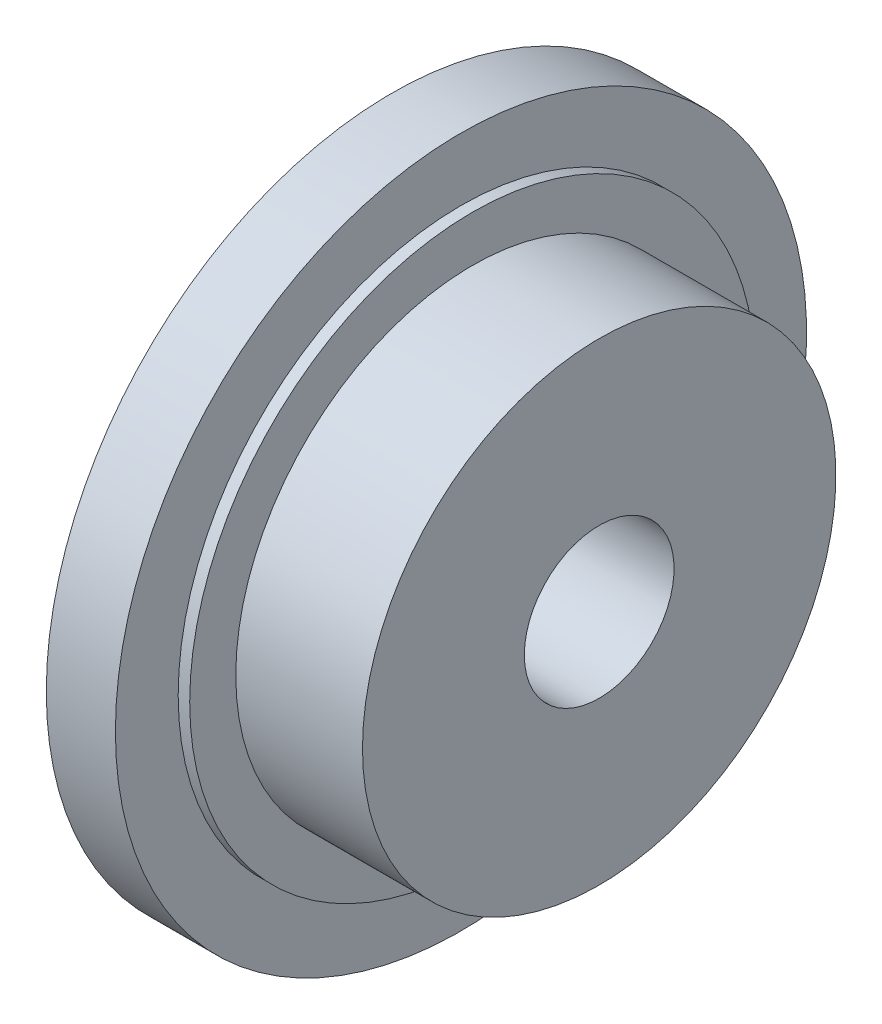
ISO-10303-21;
HEADER;
FILE_DESCRIPTION(('STEP AP214'),'2;1');
FILE_NAME('part.step','',(''),(''),'','','');
FILE_SCHEMA(('AUTOMOTIVE_DESIGN { 1 0 10303 214 1 1 1 1 }'));
ENDSEC;
DATA;
#1=APPLICATION_CONTEXT('core data for automotive mechanical design processes');
#2=APPLICATION_PROTOCOL_DEFINITION('international standard','automotive_design',2000,#1);
#3=PRODUCT_CONTEXT('',#1,'mechanical');
#4=PRODUCT('Part','Part','',(#3));
#5=PRODUCT_RELATED_PRODUCT_CATEGORY('part','',(#4));
#6=PRODUCT_DEFINITION_FORMATION('','',#4);
#7=PRODUCT_DEFINITION_CONTEXT('part definition',#1,'design');
#8=PRODUCT_DEFINITION('design','',#6,#7);
#9=PRODUCT_DEFINITION_SHAPE('','',#8);
#10=(LENGTH_UNIT() NAMED_UNIT(*) SI_UNIT(.MILLI.,.METRE.));
#11=(NAMED_UNIT(*) PLANE_ANGLE_UNIT() SI_UNIT($,.RADIAN.));
#12=(NAMED_UNIT(*) SI_UNIT($,.STERADIAN.) SOLID_ANGLE_UNIT());
#13=UNCERTAINTY_MEASURE_WITH_UNIT(LENGTH_MEASURE(1.E-05),#10,'distance_accuracy_value','');
#14=(GEOMETRIC_REPRESENTATION_CONTEXT(3) GLOBAL_UNCERTAINTY_ASSIGNED_CONTEXT((#13)) GLOBAL_UNIT_ASSIGNED_CONTEXT((#10,
#11,#12)) REPRESENTATION_CONTEXT('',''));
#15=CARTESIAN_POINT('',(0.,0.,0.));
#16=DIRECTION('',(0.,0.,1.));
#17=DIRECTION('',(1.,0.,0.));
#18=AXIS2_PLACEMENT_3D('',#15,#16,#17);
#19=CARTESIAN_POINT('',(0.,0.,0.));
#20=DIRECTION('',(-1.,0.,0.));
#21=DIRECTION('',(0.,0.,1.));
#22=AXIS2_PLACEMENT_3D('',#19,#20,#21);
#23=CYLINDRICAL_SURFACE('',#22,7.5);
#24=CARTESIAN_POINT('',(6.,0.,0.));
#25=DIRECTION('',(-1.,0.,0.));
#26=DIRECTION('',(0.,0.,1.));
#27=AXIS2_PLACEMENT_3D('',#24,#25,#26);
#28=CIRCLE('',#27,7.5);
#29=CARTESIAN_POINT('',(6.,0.,7.5));
#30=VERTEX_POINT('',#29);
#31=EDGE_CURVE('E72',#30,#30,#28,.T.);
#32=ORIENTED_EDGE('',*,*,#31,.F.);
#33=EDGE_LOOP('',(#32));
#34=FACE_BOUND('',#33,.T.);
#35=CARTESIAN_POINT('',(2.,0.,0.));
#36=DIRECTION('',(-1.,0.,0.));
#37=DIRECTION('',(0.,0.,1.));
#38=AXIS2_PLACEMENT_3D('',#35,#36,#37);
#39=CIRCLE('',#38,7.5);
#40=CARTESIAN_POINT('',(2.,0.,7.5));
#41=VERTEX_POINT('',#40);
#42=EDGE_CURVE('E44',#41,#41,#39,.F.);
#43=ORIENTED_EDGE('',*,*,#42,.F.);
#44=EDGE_LOOP('',(#43));
#45=FACE_BOUND('',#44,.T.);
#46=ADVANCED_FACE('F40',(#34,#45),#23,.F.);
#47=CARTESIAN_POINT('',(0.,7.5,0.));
#48=DIRECTION('',(1.,0.,0.));
#49=DIRECTION('',(0.,0.,-1.));
#50=AXIS2_PLACEMENT_3D('',#47,#48,#49);
#51=PLANE('',#50);
#52=CARTESIAN_POINT('',(0.,0.,0.));
#53=DIRECTION('',(-1.,0.,0.));
#54=DIRECTION('',(0.,0.,1.));
#55=AXIS2_PLACEMENT_3D('',#52,#53,#54);
#56=CIRCLE('',#55,8.5);
#57=CARTESIAN_POINT('',(0.,0.,8.5));
#58=VERTEX_POINT('',#57);
#59=EDGE_CURVE('E111',#58,#58,#56,.T.);
#60=ORIENTED_EDGE('',*,*,#59,.F.);
#61=EDGE_LOOP('',(#60));
#62=FACE_BOUND('',#61,.T.);
#63=CARTESIAN_POINT('',(0.,20.,0.));
#64=DIRECTION('',(-1.,0.,0.));
#65=DIRECTION('',(0.,0.,1.));
#66=AXIS2_PLACEMENT_3D('',#63,#64,#65);
#67=CIRCLE('',#66,2.5);
#68=CARTESIAN_POINT('',(0.,20.,2.5));
#69=VERTEX_POINT('',#68);
#70=EDGE_CURVE('E101',#69,#69,#67,.T.);
#71=ORIENTED_EDGE('',*,*,#70,.F.);
#72=EDGE_LOOP('',(#71));
#73=FACE_BOUND('',#72,.T.);
#74=CARTESIAN_POINT('',(0.,10.,-17.3205080756888));
#75=DIRECTION('',(-1.,0.,0.));
#76=DIRECTION('',(0.,0.,1.));
#77=AXIS2_PLACEMENT_3D('',#74,#75,#76);
#78=CIRCLE('',#77,2.5);
#79=CARTESIAN_POINT('',(0.,10.,-14.8205080756888));
#80=VERTEX_POINT('',#79);
#81=EDGE_CURVE('E80',#80,#80,#78,.T.);
#82=ORIENTED_EDGE('',*,*,#81,.F.);
#83=EDGE_LOOP('',(#82));
#84=FACE_BOUND('',#83,.T.);
#85=CARTESIAN_POINT('',(0.,-10.,-17.3205080756888));
#86=DIRECTION('',(-1.,0.,0.));
#87=DIRECTION('',(0.,0.,1.));
#88=AXIS2_PLACEMENT_3D('',#85,#86,#87);
#89=CIRCLE('',#88,2.5);
#90=CARTESIAN_POINT('',(0.,-10.,-14.8205080756888));
#91=VERTEX_POINT('',#90);
#92=EDGE_CURVE('E79',#91,#91,#89,.T.);
#93=ORIENTED_EDGE('',*,*,#92,.F.);
#94=EDGE_LOOP('',(#93));
#95=FACE_BOUND('',#94,.T.);
#96=CARTESIAN_POINT('',(0.,-20.,0.));
#97=DIRECTION('',(-1.,0.,0.));
#98=DIRECTION('',(0.,0.,1.));
#99=AXIS2_PLACEMENT_3D('',#96,#97,#98);
#100=CIRCLE('',#99,2.5);
#101=CARTESIAN_POINT('',(0.,-20.,2.5));
#102=VERTEX_POINT('',#101);
#103=EDGE_CURVE('E86',#102,#102,#100,.T.);
#104=ORIENTED_EDGE('',*,*,#103,.F.);
#105=EDGE_LOOP('',(#104));
#106=FACE_BOUND('',#105,.T.);
#107=CARTESIAN_POINT('',(0.,-10.,17.3205080756888));
#108=DIRECTION('',(-1.,0.,0.));
#109=DIRECTION('',(0.,0.,1.));
#110=AXIS2_PLACEMENT_3D('',#107,#108,#109);
#111=CIRCLE('',#110,2.5);
#112=CARTESIAN_POINT('',(0.,-10.,19.8205080756888));
#113=VERTEX_POINT('',#112);
#114=EDGE_CURVE('E92',#113,#113,#111,.T.);
#115=ORIENTED_EDGE('',*,*,#114,.F.);
#116=EDGE_LOOP('',(#115));
#117=FACE_BOUND('',#116,.T.);
#118=CARTESIAN_POINT('',(0.,10.,17.3205080756888));
#119=DIRECTION('',(-1.,0.,0.));
#120=DIRECTION('',(0.,0.,1.));
#121=AXIS2_PLACEMENT_3D('',#118,#119,#120);
#122=CIRCLE('',#121,2.5);
#123=CARTESIAN_POINT('',(0.,10.,19.8205080756888));
#124=VERTEX_POINT('',#123);
#125=EDGE_CURVE('E98',#124,#124,#122,.T.);
#126=ORIENTED_EDGE('',*,*,#125,.F.);
#127=EDGE_LOOP('',(#126));
#128=FACE_BOUND('',#127,.T.);
#129=CARTESIAN_POINT('',(0.,0.,0.));
#130=DIRECTION('',(-1.,0.,0.));
#131=DIRECTION('',(0.,0.,1.));
#132=AXIS2_PLACEMENT_3D('',#129,#130,#131);
#133=CIRCLE('',#132,30.);
#134=CARTESIAN_POINT('',(0.,0.,30.));
#135=VERTEX_POINT('',#134);
#136=EDGE_CURVE('E10',#135,#135,#133,.T.);
#137=ORIENTED_EDGE('',*,*,#136,.T.);
#138=EDGE_LOOP('',(#137));
#139=FACE_BOUND('',#138,.T.);
#140=ADVANCED_FACE('F42',(#62,#73,#84,#95,#106,#117,#128,#139),#51,.F.);
#141=CARTESIAN_POINT('',(0.,0.,0.));
#142=DIRECTION('',(-1.,0.,0.));
#143=DIRECTION('',(0.,0.,1.));
#144=AXIS2_PLACEMENT_3D('',#141,#142,#143);
#145=CYLINDRICAL_SURFACE('',#144,30.);
#146=ORIENTED_EDGE('',*,*,#136,.F.);
#147=EDGE_LOOP('',(#146));
#148=FACE_BOUND('',#147,.T.);
#149=CARTESIAN_POINT('',(6.,0.,0.));
#150=DIRECTION('',(-1.,0.,0.));
#151=DIRECTION('',(0.,0.,1.));
#152=AXIS2_PLACEMENT_3D('',#149,#150,#151);
#153=CIRCLE('',#152,30.);
#154=CARTESIAN_POINT('',(6.,0.,30.));
#155=VERTEX_POINT('',#154);
#156=EDGE_CURVE('E48',#155,#155,#153,.T.);
#157=ORIENTED_EDGE('',*,*,#156,.T.);
#158=EDGE_LOOP('',(#157));
#159=FACE_BOUND('',#158,.T.);
#160=ADVANCED_FACE('F130',(#148,#159),#145,.T.);
#161=CARTESIAN_POINT('',(6.,30.,0.));
#162=DIRECTION('',(-1.,0.,0.));
#163=DIRECTION('',(0.,0.,1.));
#164=AXIS2_PLACEMENT_3D('',#161,#162,#163);
#165=PLANE('',#164);
#166=ORIENTED_EDGE('',*,*,#156,.F.);
#167=EDGE_LOOP('',(#166));
#168=FACE_BOUND('',#167,.T.);
#169=CARTESIAN_POINT('',(6.,0.,0.));
#170=DIRECTION('',(-1.,0.,0.));
#171=DIRECTION('',(0.,0.,1.));
#172=AXIS2_PLACEMENT_3D('',#169,#170,#171);
#173=CIRCLE('',#172,24.55);
#174=CARTESIAN_POINT('',(6.,0.,24.55));
#175=VERTEX_POINT('',#174);
#176=EDGE_CURVE('E52',#175,#175,#173,.T.);
#177=ORIENTED_EDGE('',*,*,#176,.T.);
#178=EDGE_LOOP('',(#177));
#179=FACE_BOUND('',#178,.T.);
#180=ADVANCED_FACE('F161',(#168,#179),#165,.F.);
#181=CARTESIAN_POINT('',(0.,0.,0.));
#182=DIRECTION('',(-1.,0.,0.));
#183=DIRECTION('',(0.,0.,1.));
#184=AXIS2_PLACEMENT_3D('',#181,#182,#183);
#185=CYLINDRICAL_SURFACE('',#184,24.55);
#186=ORIENTED_EDGE('',*,*,#176,.F.);
#187=EDGE_LOOP('',(#186));
#188=FACE_BOUND('',#187,.T.);
#189=CARTESIAN_POINT('',(7.,0.,0.));
#190=DIRECTION('',(-1.,0.,0.));
#191=DIRECTION('',(0.,0.,1.));
#192=AXIS2_PLACEMENT_3D('',#189,#190,#191);
#193=CIRCLE('',#192,24.55);
#194=CARTESIAN_POINT('',(7.,0.,24.55));
#195=VERTEX_POINT('',#194);
#196=EDGE_CURVE('E57',#195,#195,#193,.T.);
#197=ORIENTED_EDGE('',*,*,#196,.T.);
#198=EDGE_LOOP('',(#197));
#199=FACE_BOUND('',#198,.T.);
#200=ADVANCED_FACE('F157',(#188,#199),#185,.T.);
#201=CARTESIAN_POINT('',(7.,24.55,0.));
#202=DIRECTION('',(-1.,0.,0.));
#203=DIRECTION('',(0.,0.,1.));
#204=AXIS2_PLACEMENT_3D('',#201,#202,#203);
#205=PLANE('',#204);
#206=ORIENTED_EDGE('',*,*,#196,.F.);
#207=EDGE_LOOP('',(#206));
#208=FACE_BOUND('',#207,.T.);
#209=CARTESIAN_POINT('',(7.,0.,0.));
#210=DIRECTION('',(-1.,0.,0.));
#211=DIRECTION('',(0.,0.,1.));
#212=AXIS2_PLACEMENT_3D('',#209,#210,#211);
#213=CIRCLE('',#212,20.55);
#214=CARTESIAN_POINT('',(7.,0.,20.55));
#215=VERTEX_POINT('',#214);
#216=EDGE_CURVE('E60',#215,#215,#213,.T.);
#217=ORIENTED_EDGE('',*,*,#216,.T.);
#218=EDGE_LOOP('',(#217));
#219=FACE_BOUND('',#218,.T.);
#220=ADVANCED_FACE('F153',(#208,#219),#205,.F.);
#221=CARTESIAN_POINT('',(0.,0.,0.));
#222=DIRECTION('',(-1.,0.,0.));
#223=DIRECTION('',(0.,0.,1.));
#224=AXIS2_PLACEMENT_3D('',#221,#222,#223);
#225=CYLINDRICAL_SURFACE('',#224,20.55);
#226=ORIENTED_EDGE('',*,*,#216,.F.);
#227=EDGE_LOOP('',(#226));
#228=FACE_BOUND('',#227,.T.);
#229=CARTESIAN_POINT('',(18.,0.,0.));
#230=DIRECTION('',(-1.,0.,0.));
#231=DIRECTION('',(0.,0.,1.));
#232=AXIS2_PLACEMENT_3D('',#229,#230,#231);
#233=CIRCLE('',#232,20.55);
#234=CARTESIAN_POINT('',(18.,0.,20.55));
#235=VERTEX_POINT('',#234);
#236=EDGE_CURVE('E63',#235,#235,#233,.T.);
#237=ORIENTED_EDGE('',*,*,#236,.T.);
#238=EDGE_LOOP('',(#237));
#239=FACE_BOUND('',#238,.T.);
#240=ADVANCED_FACE('F149',(#228,#239),#225,.T.);
#241=CARTESIAN_POINT('',(18.,20.55,0.));
#242=DIRECTION('',(-1.,0.,0.));
#243=DIRECTION('',(0.,0.,1.));
#244=AXIS2_PLACEMENT_3D('',#241,#242,#243);
#245=PLANE('',#244);
#246=ORIENTED_EDGE('',*,*,#236,.F.);
#247=EDGE_LOOP('',(#246));
#248=FACE_BOUND('',#247,.T.);
#249=CARTESIAN_POINT('',(18.,0.,0.));
#250=DIRECTION('',(-1.,0.,0.));
#251=DIRECTION('',(0.,0.,1.));
#252=AXIS2_PLACEMENT_3D('',#249,#250,#251);
#253=CIRCLE('',#252,6.5);
#254=CARTESIAN_POINT('',(18.,0.,6.5));
#255=VERTEX_POINT('',#254);
#256=EDGE_CURVE('E66',#255,#255,#253,.T.);
#257=ORIENTED_EDGE('',*,*,#256,.T.);
#258=EDGE_LOOP('',(#257));
#259=FACE_BOUND('',#258,.T.);
#260=ADVANCED_FACE('F145',(#248,#259),#245,.F.);
#261=CARTESIAN_POINT('',(0.,0.,0.));
#262=DIRECTION('',(-1.,0.,0.));
#263=DIRECTION('',(0.,0.,1.));
#264=AXIS2_PLACEMENT_3D('',#261,#262,#263);
#265=CYLINDRICAL_SURFACE('',#264,6.5);
#266=ORIENTED_EDGE('',*,*,#256,.F.);
#267=EDGE_LOOP('',(#266));
#268=FACE_BOUND('',#267,.T.);
#269=CARTESIAN_POINT('',(6.,0.,0.));
#270=DIRECTION('',(-1.,0.,0.));
#271=DIRECTION('',(0.,0.,1.));
#272=AXIS2_PLACEMENT_3D('',#269,#270,#271);
#273=CIRCLE('',#272,6.5);
#274=CARTESIAN_POINT('',(6.,0.,6.5));
#275=VERTEX_POINT('',#274);
#276=EDGE_CURVE('E69',#275,#275,#273,.T.);
#277=ORIENTED_EDGE('',*,*,#276,.T.);
#278=EDGE_LOOP('',(#277));
#279=FACE_BOUND('',#278,.T.);
#280=ADVANCED_FACE('F141',(#268,#279),#265,.F.);
#281=CARTESIAN_POINT('',(6.,6.5,0.));
#282=DIRECTION('',(1.,0.,0.));
#283=DIRECTION('',(0.,0.,-1.));
#284=AXIS2_PLACEMENT_3D('',#281,#282,#283);
#285=PLANE('',#284);
#286=ORIENTED_EDGE('',*,*,#276,.F.);
#287=EDGE_LOOP('',(#286));
#288=FACE_BOUND('',#287,.T.);
#289=ORIENTED_EDGE('',*,*,#31,.T.);
#290=EDGE_LOOP('',(#289));
#291=FACE_BOUND('',#290,.T.);
#292=ADVANCED_FACE('F137',(#288,#291),#285,.F.);
#293=CARTESIAN_POINT('',(4.5,10.,17.3205080756888));
#294=DIRECTION('',(-1.,0.,0.));
#295=DIRECTION('',(0.,0.,1.));
#296=AXIS2_PLACEMENT_3D('',#293,#294,#295);
#297=CYLINDRICAL_SURFACE('',#296,2.5);
#298=CARTESIAN_POINT('',(4.5,10.,17.3205080756888));
#299=DIRECTION('',(-1.,0.,0.));
#300=DIRECTION('',(0.,0.,1.));
#301=AXIS2_PLACEMENT_3D('',#298,#299,#300);
#302=CIRCLE('',#301,2.5);
#303=CARTESIAN_POINT('',(4.5,10.,19.8205080756888));
#304=VERTEX_POINT('',#303);
#305=EDGE_CURVE('E95',#304,#304,#302,.T.);
#306=ORIENTED_EDGE('',*,*,#305,.F.);
#307=EDGE_LOOP('',(#306));
#308=FACE_BOUND('',#307,.T.);
#309=ORIENTED_EDGE('',*,*,#125,.T.);
#310=EDGE_LOOP('',(#309));
#311=FACE_BOUND('',#310,.T.);
#312=ADVANCED_FACE('F140',(#308,#311),#297,.F.);
#313=CARTESIAN_POINT('',(4.5,10.,17.3205080756888));
#314=DIRECTION('',(-1.,0.,0.));
#315=DIRECTION('',(0.,0.,1.));
#316=AXIS2_PLACEMENT_3D('',#313,#314,#315);
#317=PLANE('',#316);
#318=ORIENTED_EDGE('',*,*,#305,.T.);
#319=EDGE_LOOP('',(#318));
#320=FACE_BOUND('',#319,.T.);
#321=ADVANCED_FACE('F227',(#320),#317,.T.);
#322=CARTESIAN_POINT('',(4.5,-10.,17.3205080756888));
#323=DIRECTION('',(-1.,0.,0.));
#324=DIRECTION('',(0.,0.,1.));
#325=AXIS2_PLACEMENT_3D('',#322,#323,#324);
#326=CYLINDRICAL_SURFACE('',#325,2.5);
#327=CARTESIAN_POINT('',(4.5,-10.,17.3205080756888));
#328=DIRECTION('',(-1.,0.,0.));
#329=DIRECTION('',(0.,0.,1.));
#330=AXIS2_PLACEMENT_3D('',#327,#328,#329);
#331=CIRCLE('',#330,2.5);
#332=CARTESIAN_POINT('',(4.5,-10.,19.8205080756888));
#333=VERTEX_POINT('',#332);
#334=EDGE_CURVE('E89',#333,#333,#331,.T.);
#335=ORIENTED_EDGE('',*,*,#334,.F.);
#336=EDGE_LOOP('',(#335));
#337=FACE_BOUND('',#336,.T.);
#338=ORIENTED_EDGE('',*,*,#114,.T.);
#339=EDGE_LOOP('',(#338));
#340=FACE_BOUND('',#339,.T.);
#341=ADVANCED_FACE('F236',(#337,#340),#326,.F.);
#342=CARTESIAN_POINT('',(4.5,-10.,17.3205080756888));
#343=DIRECTION('',(-1.,0.,0.));
#344=DIRECTION('',(0.,0.,1.));
#345=AXIS2_PLACEMENT_3D('',#342,#343,#344);
#346=PLANE('',#345);
#347=ORIENTED_EDGE('',*,*,#334,.T.);
#348=EDGE_LOOP('',(#347));
#349=FACE_BOUND('',#348,.T.);
#350=ADVANCED_FACE('F245',(#349),#346,.T.);
#351=CARTESIAN_POINT('',(4.5,-20.,0.));
#352=DIRECTION('',(-1.,0.,0.));
#353=DIRECTION('',(0.,0.,1.));
#354=AXIS2_PLACEMENT_3D('',#351,#352,#353);
#355=CYLINDRICAL_SURFACE('',#354,2.5);
#356=CARTESIAN_POINT('',(4.5,-20.,0.));
#357=DIRECTION('',(-1.,0.,0.));
#358=DIRECTION('',(0.,0.,1.));
#359=AXIS2_PLACEMENT_3D('',#356,#357,#358);
#360=CIRCLE('',#359,2.5);
#361=CARTESIAN_POINT('',(4.5,-20.,2.5));
#362=VERTEX_POINT('',#361);
#363=EDGE_CURVE('E83',#362,#362,#360,.T.);
#364=ORIENTED_EDGE('',*,*,#363,.F.);
#365=EDGE_LOOP('',(#364));
#366=FACE_BOUND('',#365,.T.);
#367=ORIENTED_EDGE('',*,*,#103,.T.);
#368=EDGE_LOOP('',(#367));
#369=FACE_BOUND('',#368,.T.);
#370=ADVANCED_FACE('F254',(#366,#369),#355,.F.);
#371=CARTESIAN_POINT('',(4.5,-20.,0.));
#372=DIRECTION('',(-1.,0.,0.));
#373=DIRECTION('',(0.,0.,1.));
#374=AXIS2_PLACEMENT_3D('',#371,#372,#373);
#375=PLANE('',#374);
#376=ORIENTED_EDGE('',*,*,#363,.T.);
#377=EDGE_LOOP('',(#376));
#378=FACE_BOUND('',#377,.T.);
#379=ADVANCED_FACE('F263',(#378),#375,.T.);
#380=CARTESIAN_POINT('',(4.5,-10.,-17.3205080756888));
#381=DIRECTION('',(-1.,0.,0.));
#382=DIRECTION('',(0.,0.,1.));
#383=AXIS2_PLACEMENT_3D('',#380,#381,#382);
#384=CYLINDRICAL_SURFACE('',#383,2.5);
#385=CARTESIAN_POINT('',(4.5,-10.,-17.3205080756888));
#386=DIRECTION('',(-1.,0.,0.));
#387=DIRECTION('',(0.,0.,1.));
#388=AXIS2_PLACEMENT_3D('',#385,#386,#387);
#389=CIRCLE('',#388,2.5);
#390=CARTESIAN_POINT('',(4.5,-10.,-14.8205080756888));
#391=VERTEX_POINT('',#390);
#392=EDGE_CURVE('E76',#391,#391,#389,.T.);
#393=ORIENTED_EDGE('',*,*,#392,.F.);
#394=EDGE_LOOP('',(#393));
#395=FACE_BOUND('',#394,.T.);
#396=ORIENTED_EDGE('',*,*,#92,.T.);
#397=EDGE_LOOP('',(#396));
#398=FACE_BOUND('',#397,.T.);
#399=ADVANCED_FACE('F272',(#395,#398),#384,.F.);
#400=CARTESIAN_POINT('',(4.5,-10.,-17.3205080756888));
#401=DIRECTION('',(-1.,0.,0.));
#402=DIRECTION('',(0.,0.,1.));
#403=AXIS2_PLACEMENT_3D('',#400,#401,#402);
#404=PLANE('',#403);
#405=ORIENTED_EDGE('',*,*,#392,.T.);
#406=EDGE_LOOP('',(#405));
#407=FACE_BOUND('',#406,.T.);
#408=ADVANCED_FACE('F135',(#407),#404,.T.);
#409=CARTESIAN_POINT('',(4.5,10.,-17.3205080756888));
#410=DIRECTION('',(-1.,0.,0.));
#411=DIRECTION('',(0.,0.,1.));
#412=AXIS2_PLACEMENT_3D('',#409,#410,#411);
#413=CYLINDRICAL_SURFACE('',#412,2.5);
#414=CARTESIAN_POINT('',(4.5,10.,-17.3205080756888));
#415=DIRECTION('',(-1.,0.,0.));
#416=DIRECTION('',(0.,0.,1.));
#417=AXIS2_PLACEMENT_3D('',#414,#415,#416);
#418=CIRCLE('',#417,2.5);
#419=CARTESIAN_POINT('',(4.5,10.,-14.8205080756888));
#420=VERTEX_POINT('',#419);
#421=EDGE_CURVE('E102',#420,#420,#418,.T.);
#422=ORIENTED_EDGE('',*,*,#421,.F.);
#423=EDGE_LOOP('',(#422));
#424=FACE_BOUND('',#423,.T.);
#425=ORIENTED_EDGE('',*,*,#81,.T.);
#426=EDGE_LOOP('',(#425));
#427=FACE_BOUND('',#426,.T.);
#428=ADVANCED_FACE('F288',(#424,#427),#413,.F.);
#429=CARTESIAN_POINT('',(4.5,10.,-17.3205080756888));
#430=DIRECTION('',(-1.,0.,0.));
#431=DIRECTION('',(0.,0.,1.));
#432=AXIS2_PLACEMENT_3D('',#429,#430,#431);
#433=PLANE('',#432);
#434=ORIENTED_EDGE('',*,*,#421,.T.);
#435=EDGE_LOOP('',(#434));
#436=FACE_BOUND('',#435,.T.);
#437=ADVANCED_FACE('F296',(#436),#433,.T.);
#438=CARTESIAN_POINT('',(4.5,20.,0.));
#439=DIRECTION('',(-1.,0.,0.));
#440=DIRECTION('',(0.,0.,1.));
#441=AXIS2_PLACEMENT_3D('',#438,#439,#440);
#442=CYLINDRICAL_SURFACE('',#441,2.5);
#443=CARTESIAN_POINT('',(4.5,20.,0.));
#444=DIRECTION('',(-1.,0.,0.));
#445=DIRECTION('',(0.,0.,1.));
#446=AXIS2_PLACEMENT_3D('',#443,#444,#445);
#447=CIRCLE('',#446,2.5);
#448=CARTESIAN_POINT('',(4.5,20.,2.5));
#449=VERTEX_POINT('',#448);
#450=EDGE_CURVE('E75',#449,#449,#447,.T.);
#451=ORIENTED_EDGE('',*,*,#450,.F.);
#452=EDGE_LOOP('',(#451));
#453=FACE_BOUND('',#452,.T.);
#454=ORIENTED_EDGE('',*,*,#70,.T.);
#455=EDGE_LOOP('',(#454));
#456=FACE_BOUND('',#455,.T.);
#457=ADVANCED_FACE('F305',(#453,#456),#442,.F.);
#458=CARTESIAN_POINT('',(4.5,20.,0.));
#459=DIRECTION('',(-1.,0.,0.));
#460=DIRECTION('',(0.,0.,1.));
#461=AXIS2_PLACEMENT_3D('',#458,#459,#460);
#462=PLANE('',#461);
#463=ORIENTED_EDGE('',*,*,#450,.T.);
#464=EDGE_LOOP('',(#463));
#465=FACE_BOUND('',#464,.T.);
#466=ADVANCED_FACE('F313',(#465),#462,.T.);
#467=CARTESIAN_POINT('',(2.,0.,0.));
#468=DIRECTION('',(-1.,0.,0.));
#469=DIRECTION('',(0.,0.,1.));
#470=AXIS2_PLACEMENT_3D('',#467,#468,#469);
#471=PLANE('',#470);
#472=CARTESIAN_POINT('',(2.,0.,0.));
#473=DIRECTION('',(-1.,0.,0.));
#474=DIRECTION('',(0.,0.,1.));
#475=AXIS2_PLACEMENT_3D('',#472,#473,#474);
#476=CIRCLE('',#475,8.5);
#477=CARTESIAN_POINT('',(2.,0.,8.5));
#478=VERTEX_POINT('',#477);
#479=EDGE_CURVE('E114',#478,#478,#476,.T.);
#480=ORIENTED_EDGE('',*,*,#479,.T.);
#481=EDGE_LOOP('',(#480));
#482=FACE_BOUND('',#481,.T.);
#483=ORIENTED_EDGE('',*,*,#42,.T.);
#484=EDGE_LOOP('',(#483));
#485=FACE_BOUND('',#484,.T.);
#486=ADVANCED_FACE('F121',(#482,#485),#471,.T.);
#487=CARTESIAN_POINT('',(2.,0.,0.));
#488=DIRECTION('',(-1.,0.,0.));
#489=DIRECTION('',(0.,0.,1.));
#490=AXIS2_PLACEMENT_3D('',#487,#488,#489);
#491=CYLINDRICAL_SURFACE('',#490,8.5);
#492=ORIENTED_EDGE('',*,*,#479,.F.);
#493=EDGE_LOOP('',(#492));
#494=FACE_BOUND('',#493,.T.);
#495=ORIENTED_EDGE('',*,*,#59,.T.);
#496=EDGE_LOOP('',(#495));
#497=FACE_BOUND('',#496,.T.);
#498=ADVANCED_FACE('F337',(#494,#497),#491,.F.);
#499=CLOSED_SHELL('',(#46,#140,#160,#180,#200,#220,#240,#260,#280,#292,#312,#321,#341,#350,#370,
#379,#399,#408,#428,#437,#457,#466,#486,#498));
#500=MANIFOLD_SOLID_BREP('B2',#499);
#501=ADVANCED_BREP_SHAPE_REPRESENTATION('',(#18,#500),#14);
#502=SHAPE_DEFINITION_REPRESENTATION(#9,#501);
ENDSEC;
END-ISO-10303-21;
